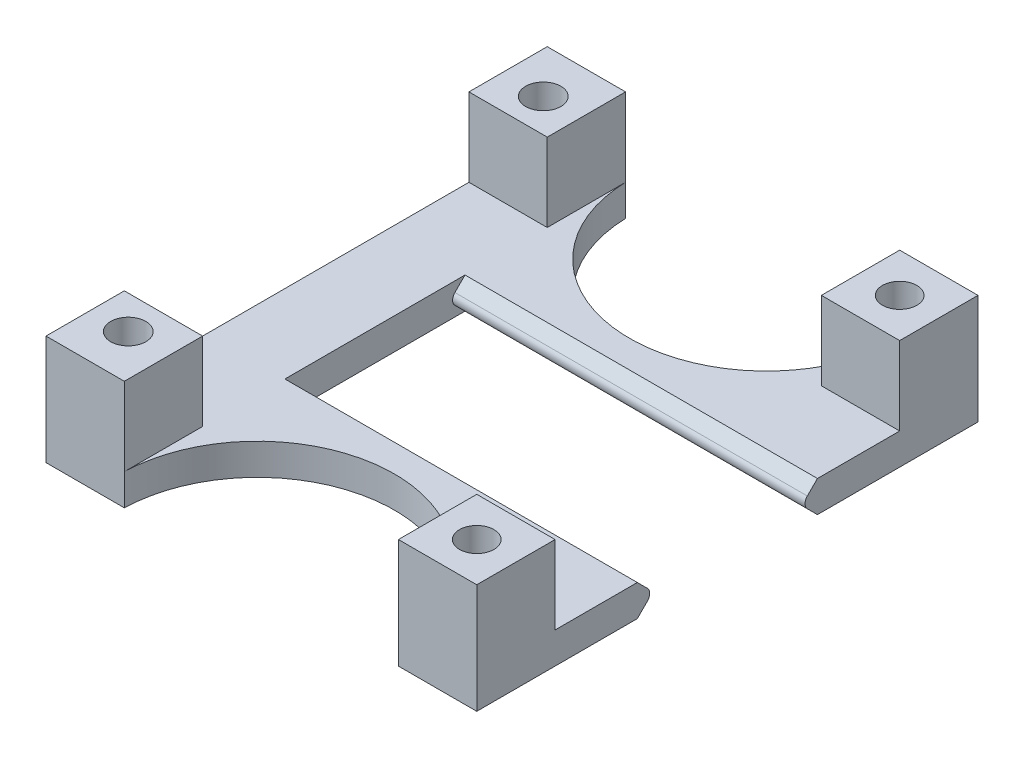
ISO-10303-21;
HEADER;
FILE_DESCRIPTION(('STEP AP214'),'2;1');
FILE_NAME('part.step','',(''),(''),'','','');
FILE_SCHEMA(('AUTOMOTIVE_DESIGN { 1 0 10303 214 1 1 1 1 }'));
ENDSEC;
DATA;
#1=APPLICATION_CONTEXT('core data for automotive mechanical design processes');
#2=APPLICATION_PROTOCOL_DEFINITION('international standard','automotive_design',2000,#1);
#3=PRODUCT_CONTEXT('',#1,'mechanical');
#4=PRODUCT('Part','Part','',(#3));
#5=PRODUCT_RELATED_PRODUCT_CATEGORY('part','',(#4));
#6=PRODUCT_DEFINITION_FORMATION('','',#4);
#7=PRODUCT_DEFINITION_CONTEXT('part definition',#1,'design');
#8=PRODUCT_DEFINITION('design','',#6,#7);
#9=PRODUCT_DEFINITION_SHAPE('','',#8);
#10=(LENGTH_UNIT() NAMED_UNIT(*) SI_UNIT(.MILLI.,.METRE.));
#11=(NAMED_UNIT(*) PLANE_ANGLE_UNIT() SI_UNIT($,.RADIAN.));
#12=(NAMED_UNIT(*) SI_UNIT($,.STERADIAN.) SOLID_ANGLE_UNIT());
#13=UNCERTAINTY_MEASURE_WITH_UNIT(LENGTH_MEASURE(1.E-05),#10,'distance_accuracy_value','');
#14=(GEOMETRIC_REPRESENTATION_CONTEXT(3) GLOBAL_UNCERTAINTY_ASSIGNED_CONTEXT((#13)) GLOBAL_UNIT_ASSIGNED_CONTEXT((#10,
#11,#12)) REPRESENTATION_CONTEXT('',''));
#15=CARTESIAN_POINT('',(0.,0.,0.));
#16=DIRECTION('',(0.,0.,1.));
#17=DIRECTION('',(1.,0.,0.));
#18=AXIS2_PLACEMENT_3D('',#15,#16,#17);
#19=CARTESIAN_POINT('',(0.,4.,0.));
#20=DIRECTION('',(0.,1.,0.));
#21=DIRECTION('',(0.,0.,1.));
#22=AXIS2_PLACEMENT_3D('',#19,#20,#21);
#23=PLANE('',#22);
#24=DIRECTION('',(1.,0.,0.));
#25=VECTOR('',#24,1.);
#26=CARTESIAN_POINT('',(5.52786404500041,4.,11.5));
#27=LINE('',#26,#25);
#28=CARTESIAN_POINT('',(10.,4.,11.5));
#29=VERTEX_POINT('',#28);
#30=CARTESIAN_POINT('',(55.,4.,11.5));
#31=VERTEX_POINT('',#30);
#32=EDGE_CURVE('E221',#29,#31,#27,.T.);
#33=ORIENTED_EDGE('',*,*,#32,.F.);
#34=DIRECTION('',(0.,0.,1.));
#35=VECTOR('',#34,1.);
#36=CARTESIAN_POINT('',(10.,4.,0.));
#37=LINE('',#36,#35);
#38=CARTESIAN_POINT('',(10.,4.,-11.5));
#39=VERTEX_POINT('',#38);
#40=EDGE_CURVE('E246',#39,#29,#37,.T.);
#41=ORIENTED_EDGE('',*,*,#40,.F.);
#42=DIRECTION('',(1.,0.,0.));
#43=VECTOR('',#42,1.);
#44=CARTESIAN_POINT('',(5.52786404500041,4.,-11.5));
#45=LINE('',#44,#43);
#46=CARTESIAN_POINT('',(55.,4.,-11.5));
#47=VERTEX_POINT('',#46);
#48=EDGE_CURVE('E452',#39,#47,#45,.T.);
#49=ORIENTED_EDGE('',*,*,#48,.T.);
#50=DIRECTION('',(0.,0.,-1.));
#51=VECTOR('',#50,1.);
#52=CARTESIAN_POINT('',(55.,4.,0.));
#53=LINE('',#52,#51);
#54=CARTESIAN_POINT('',(55.,4.,-22.));
#55=VERTEX_POINT('',#54);
#56=EDGE_CURVE('E67',#47,#55,#53,.T.);
#57=ORIENTED_EDGE('',*,*,#56,.T.);
#58=DIRECTION('',(1.,0.,0.));
#59=VECTOR('',#58,1.);
#60=CARTESIAN_POINT('',(45.,4.,-22.));
#61=LINE('',#60,#59);
#62=CARTESIAN_POINT('',(45.,4.,-22.));
#63=VERTEX_POINT('',#62);
#64=EDGE_CURVE('E62',#63,#55,#61,.T.);
#65=ORIENTED_EDGE('',*,*,#64,.F.);
#66=DIRECTION('',(0.,0.,1.));
#67=VECTOR('',#66,1.);
#68=CARTESIAN_POINT('',(45.,4.,-32.));
#69=LINE('',#68,#67);
#70=CARTESIAN_POINT('',(45.,4.,-32.));
#71=VERTEX_POINT('',#70);
#72=EDGE_CURVE('E430',#71,#63,#69,.T.);
#73=ORIENTED_EDGE('',*,*,#72,.F.);
#74=CARTESIAN_POINT('',(27.5,4.,-32.5073529411765));
#75=DIRECTION('',(0.,1.,0.));
#76=DIRECTION('',(0.,0.,1.));
#77=AXIS2_PLACEMENT_3D('',#74,#75,#76);
#78=CIRCLE('',#77,17.5073529411765);
#79=CARTESIAN_POINT('',(10.,4.,-32.));
#80=VERTEX_POINT('',#79);
#81=EDGE_CURVE('E296',#71,#80,#78,.F.);
#82=ORIENTED_EDGE('',*,*,#81,.T.);
#83=DIRECTION('',(0.,0.,-1.));
#84=VECTOR('',#83,1.);
#85=CARTESIAN_POINT('',(10.,4.,-22.));
#86=LINE('',#85,#84);
#87=CARTESIAN_POINT('',(10.,4.,-22.));
#88=VERTEX_POINT('',#87);
#89=EDGE_CURVE('E351',#88,#80,#86,.T.);
#90=ORIENTED_EDGE('',*,*,#89,.F.);
#91=DIRECTION('',(1.,0.,0.));
#92=VECTOR('',#91,1.);
#93=CARTESIAN_POINT('',(0.,4.,-22.));
#94=LINE('',#93,#92);
#95=CARTESIAN_POINT('',(0.,4.,-22.));
#96=VERTEX_POINT('',#95);
#97=EDGE_CURVE('E348',#96,#88,#94,.T.);
#98=ORIENTED_EDGE('',*,*,#97,.F.);
#99=DIRECTION('',(0.,0.,-1.));
#100=VECTOR('',#99,1.);
#101=CARTESIAN_POINT('',(0.,4.,0.));
#102=LINE('',#101,#100);
#103=CARTESIAN_POINT('',(0.,4.,22.));
#104=VERTEX_POINT('',#103);
#105=EDGE_CURVE('E251',#104,#96,#102,.T.);
#106=ORIENTED_EDGE('',*,*,#105,.F.);
#107=DIRECTION('',(-1.,0.,0.));
#108=VECTOR('',#107,1.);
#109=CARTESIAN_POINT('',(10.,4.,22.));
#110=LINE('',#109,#108);
#111=CARTESIAN_POINT('',(10.,4.,22.));
#112=VERTEX_POINT('',#111);
#113=EDGE_CURVE('E405',#112,#104,#110,.T.);
#114=ORIENTED_EDGE('',*,*,#113,.F.);
#115=DIRECTION('',(0.,0.,-1.));
#116=VECTOR('',#115,1.);
#117=CARTESIAN_POINT('',(9.99999999999999,4.,32.));
#118=LINE('',#117,#116);
#119=CARTESIAN_POINT('',(9.99999999999999,4.,32.));
#120=VERTEX_POINT('',#119);
#121=EDGE_CURVE('E408',#120,#112,#118,.T.);
#122=ORIENTED_EDGE('',*,*,#121,.F.);
#123=CARTESIAN_POINT('',(27.5,4.,32.5073529411765));
#124=DIRECTION('',(0.,1.,0.));
#125=DIRECTION('',(0.,0.,1.));
#126=AXIS2_PLACEMENT_3D('',#123,#124,#125);
#127=CIRCLE('',#126,17.5073529411765);
#128=CARTESIAN_POINT('',(45.,4.,32.));
#129=VERTEX_POINT('',#128);
#130=EDGE_CURVE('E247',#129,#120,#127,.T.);
#131=ORIENTED_EDGE('',*,*,#130,.F.);
#132=DIRECTION('',(0.,0.,1.));
#133=VECTOR('',#132,1.);
#134=CARTESIAN_POINT('',(45.,4.,32.));
#135=LINE('',#134,#133);
#136=CARTESIAN_POINT('',(45.,4.,22.));
#137=VERTEX_POINT('',#136);
#138=EDGE_CURVE('E362',#137,#129,#135,.T.);
#139=ORIENTED_EDGE('',*,*,#138,.F.);
#140=DIRECTION('',(-1.,0.,0.));
#141=VECTOR('',#140,1.);
#142=CARTESIAN_POINT('',(45.,4.,22.));
#143=LINE('',#142,#141);
#144=CARTESIAN_POINT('',(55.,4.,22.));
#145=VERTEX_POINT('',#144);
#146=EDGE_CURVE('E244',#145,#137,#143,.T.);
#147=ORIENTED_EDGE('',*,*,#146,.F.);
#148=DIRECTION('',(0.,0.,1.));
#149=VECTOR('',#148,1.);
#150=CARTESIAN_POINT('',(55.,4.,0.));
#151=LINE('',#150,#149);
#152=EDGE_CURVE('E237',#31,#145,#151,.T.);
#153=ORIENTED_EDGE('',*,*,#152,.F.);
#154=EDGE_LOOP('',(#33,#41,#49,#57,#65,#73,#82,#90,#98,#106,#114,#122,#131,#139,#147,#153));
#155=FACE_BOUND('',#154,.T.);
#156=ADVANCED_FACE('F47',(#155),#23,.T.);
#157=CARTESIAN_POINT('',(0.,4.,-32.));
#158=DIRECTION('',(0.,0.,1.));
#159=DIRECTION('',(1.,0.,0.));
#160=AXIS2_PLACEMENT_3D('',#157,#158,#159);
#161=PLANE('',#160);
#162=DIRECTION('',(-1.,0.,0.));
#163=VECTOR('',#162,1.);
#164=CARTESIAN_POINT('',(0.,0.,-32.));
#165=LINE('',#164,#163);
#166=CARTESIAN_POINT('',(55.,0.,-32.));
#167=VERTEX_POINT('',#166);
#168=CARTESIAN_POINT('',(45.,0.,-32.));
#169=VERTEX_POINT('',#168);
#170=EDGE_CURVE('E270',#167,#169,#165,.T.);
#171=ORIENTED_EDGE('',*,*,#170,.T.);
#172=DIRECTION('',(0.,-1.,0.));
#173=VECTOR('',#172,1.);
#174=CARTESIAN_POINT('',(45.,4.,-32.));
#175=LINE('',#174,#173);
#176=EDGE_CURVE('E12',#71,#169,#175,.T.);
#177=ORIENTED_EDGE('',*,*,#176,.F.);
#178=DIRECTION('',(0.,-1.,0.));
#179=VECTOR('',#178,1.);
#180=CARTESIAN_POINT('',(45.,14.,-32.));
#181=LINE('',#180,#179);
#182=CARTESIAN_POINT('',(45.,14.,-32.));
#183=VERTEX_POINT('',#182);
#184=EDGE_CURVE('E423',#183,#71,#181,.T.);
#185=ORIENTED_EDGE('',*,*,#184,.F.);
#186=DIRECTION('',(-1.,0.,0.));
#187=VECTOR('',#186,1.);
#188=CARTESIAN_POINT('',(55.,14.,-32.));
#189=LINE('',#188,#187);
#190=CARTESIAN_POINT('',(55.,14.,-32.));
#191=VERTEX_POINT('',#190);
#192=EDGE_CURVE('E436',#191,#183,#189,.T.);
#193=ORIENTED_EDGE('',*,*,#192,.F.);
#194=DIRECTION('',(0.,-1.,0.));
#195=VECTOR('',#194,1.);
#196=CARTESIAN_POINT('',(55.,4.,-32.));
#197=LINE('',#196,#195);
#198=EDGE_CURVE('E256',#191,#167,#197,.T.);
#199=ORIENTED_EDGE('',*,*,#198,.T.);
#200=EDGE_LOOP('',(#171,#177,#185,#193,#199));
#201=FACE_BOUND('',#200,.T.);
#202=ADVANCED_FACE('F506',(#201),#161,.F.);
#203=CARTESIAN_POINT('',(27.5,4.,-32.5073529411765));
#204=DIRECTION('',(0.,-1.,0.));
#205=DIRECTION('',(0.,0.,-1.));
#206=AXIS2_PLACEMENT_3D('',#203,#204,#205);
#207=CYLINDRICAL_SURFACE('',#206,17.5073529411765);
#208=CARTESIAN_POINT('',(27.5,0.,-32.5073529411765));
#209=DIRECTION('',(0.,1.,0.));
#210=DIRECTION('',(0.,0.,1.));
#211=AXIS2_PLACEMENT_3D('',#208,#209,#210);
#212=CIRCLE('',#211,17.5073529411765);
#213=CARTESIAN_POINT('',(10.,0.,-32.));
#214=VERTEX_POINT('',#213);
#215=EDGE_CURVE('E273',#169,#214,#212,.F.);
#216=ORIENTED_EDGE('',*,*,#215,.T.);
#217=DIRECTION('',(0.,-1.,0.));
#218=VECTOR('',#217,1.);
#219=CARTESIAN_POINT('',(10.,4.,-32.));
#220=LINE('',#219,#218);
#221=EDGE_CURVE('E55',#80,#214,#220,.T.);
#222=ORIENTED_EDGE('',*,*,#221,.F.);
#223=ORIENTED_EDGE('',*,*,#81,.F.);
#224=ORIENTED_EDGE('',*,*,#176,.T.);
#225=EDGE_LOOP('',(#216,#222,#223,#224));
#226=FACE_BOUND('',#225,.T.);
#227=ADVANCED_FACE('F504',(#226),#207,.F.);
#228=CARTESIAN_POINT('',(0.,4.,-32.));
#229=DIRECTION('',(0.,0.,1.));
#230=DIRECTION('',(1.,0.,0.));
#231=AXIS2_PLACEMENT_3D('',#228,#229,#230);
#232=PLANE('',#231);
#233=DIRECTION('',(-1.,0.,0.));
#234=VECTOR('',#233,1.);
#235=CARTESIAN_POINT('',(0.,0.,-32.));
#236=LINE('',#235,#234);
#237=CARTESIAN_POINT('',(0.,0.,-32.));
#238=VERTEX_POINT('',#237);
#239=EDGE_CURVE('E275',#214,#238,#236,.T.);
#240=ORIENTED_EDGE('',*,*,#239,.T.);
#241=DIRECTION('',(0.,-1.,0.));
#242=VECTOR('',#241,1.);
#243=CARTESIAN_POINT('',(0.,4.,-32.));
#244=LINE('',#243,#242);
#245=CARTESIAN_POINT('',(0.,14.,-32.));
#246=VERTEX_POINT('',#245);
#247=EDGE_CURVE('E308',#246,#238,#244,.T.);
#248=ORIENTED_EDGE('',*,*,#247,.F.);
#249=DIRECTION('',(-1.,0.,0.));
#250=VECTOR('',#249,1.);
#251=CARTESIAN_POINT('',(10.,14.,-32.));
#252=LINE('',#251,#250);
#253=CARTESIAN_POINT('',(10.,14.,-32.));
#254=VERTEX_POINT('',#253);
#255=EDGE_CURVE('E335',#254,#246,#252,.T.);
#256=ORIENTED_EDGE('',*,*,#255,.F.);
#257=DIRECTION('',(0.,-1.,0.));
#258=VECTOR('',#257,1.);
#259=CARTESIAN_POINT('',(10.,14.,-32.));
#260=LINE('',#259,#258);
#261=EDGE_CURVE('E317',#254,#80,#260,.T.);
#262=ORIENTED_EDGE('',*,*,#261,.T.);
#263=ORIENTED_EDGE('',*,*,#221,.T.);
#264=EDGE_LOOP('',(#240,#248,#256,#262,#263));
#265=FACE_BOUND('',#264,.T.);
#266=ADVANCED_FACE('F314',(#265),#232,.F.);
#267=CARTESIAN_POINT('',(0.,4.,0.));
#268=DIRECTION('',(-1.,0.,0.));
#269=DIRECTION('',(0.,0.,1.));
#270=AXIS2_PLACEMENT_3D('',#267,#268,#269);
#271=PLANE('',#270);
#272=DIRECTION('',(0.,0.,-1.));
#273=VECTOR('',#272,1.);
#274=CARTESIAN_POINT('',(0.,0.,0.));
#275=LINE('',#274,#273);
#276=CARTESIAN_POINT('',(0.,0.,32.));
#277=VERTEX_POINT('',#276);
#278=EDGE_CURVE('E278',#277,#238,#275,.T.);
#279=ORIENTED_EDGE('',*,*,#278,.F.);
#280=DIRECTION('',(0.,-1.,0.));
#281=VECTOR('',#280,1.);
#282=CARTESIAN_POINT('',(0.,4.,32.));
#283=LINE('',#282,#281);
#284=CARTESIAN_POINT('',(0.,14.,32.));
#285=VERTEX_POINT('',#284);
#286=EDGE_CURVE('E306',#285,#277,#283,.T.);
#287=ORIENTED_EDGE('',*,*,#286,.F.);
#288=DIRECTION('',(0.,0.,1.));
#289=VECTOR('',#288,1.);
#290=CARTESIAN_POINT('',(0.,14.,22.));
#291=LINE('',#290,#289);
#292=CARTESIAN_POINT('',(0.,14.,22.));
#293=VERTEX_POINT('',#292);
#294=EDGE_CURVE('E413',#293,#285,#291,.T.);
#295=ORIENTED_EDGE('',*,*,#294,.F.);
#296=DIRECTION('',(0.,-1.,0.));
#297=VECTOR('',#296,1.);
#298=CARTESIAN_POINT('',(0.,14.,22.));
#299=LINE('',#298,#297);
#300=EDGE_CURVE('E387',#293,#104,#299,.T.);
#301=ORIENTED_EDGE('',*,*,#300,.T.);
#302=ORIENTED_EDGE('',*,*,#105,.T.);
#303=DIRECTION('',(0.,-1.,0.));
#304=VECTOR('',#303,1.);
#305=CARTESIAN_POINT('',(0.,14.,-22.));
#306=LINE('',#305,#304);
#307=CARTESIAN_POINT('',(0.,14.,-22.));
#308=VERTEX_POINT('',#307);
#309=EDGE_CURVE('E342',#308,#96,#306,.T.);
#310=ORIENTED_EDGE('',*,*,#309,.F.);
#311=DIRECTION('',(0.,0.,1.));
#312=VECTOR('',#311,1.);
#313=CARTESIAN_POINT('',(0.,14.,-32.));
#314=LINE('',#313,#312);
#315=EDGE_CURVE('E333',#246,#308,#314,.T.);
#316=ORIENTED_EDGE('',*,*,#315,.F.);
#317=ORIENTED_EDGE('',*,*,#247,.T.);
#318=EDGE_LOOP('',(#279,#287,#295,#301,#302,#310,#316,#317));
#319=FACE_BOUND('',#318,.T.);
#320=ADVANCED_FACE('F328',(#319),#271,.T.);
#321=CARTESIAN_POINT('',(0.,4.,32.));
#322=DIRECTION('',(0.,0.,1.));
#323=DIRECTION('',(1.,0.,0.));
#324=AXIS2_PLACEMENT_3D('',#321,#322,#323);
#325=PLANE('',#324);
#326=DIRECTION('',(-1.,0.,0.));
#327=VECTOR('',#326,1.);
#328=CARTESIAN_POINT('',(0.,0.,32.));
#329=LINE('',#328,#327);
#330=CARTESIAN_POINT('',(10.,0.,32.));
#331=VERTEX_POINT('',#330);
#332=EDGE_CURVE('E281',#331,#277,#329,.T.);
#333=ORIENTED_EDGE('',*,*,#332,.F.);
#334=DIRECTION('',(0.,-1.,0.));
#335=VECTOR('',#334,1.);
#336=CARTESIAN_POINT('',(10.,4.,32.));
#337=LINE('',#336,#335);
#338=EDGE_CURVE('E304',#120,#331,#337,.T.);
#339=ORIENTED_EDGE('',*,*,#338,.F.);
#340=DIRECTION('',(0.,-1.,0.));
#341=VECTOR('',#340,1.);
#342=CARTESIAN_POINT('',(9.99999999999999,14.,32.));
#343=LINE('',#342,#341);
#344=CARTESIAN_POINT('',(9.99999999999999,14.,32.));
#345=VERTEX_POINT('',#344);
#346=EDGE_CURVE('E402',#345,#120,#343,.T.);
#347=ORIENTED_EDGE('',*,*,#346,.F.);
#348=DIRECTION('',(1.,0.,0.));
#349=VECTOR('',#348,1.);
#350=CARTESIAN_POINT('',(0.,14.,32.));
#351=LINE('',#350,#349);
#352=EDGE_CURVE('E404',#285,#345,#351,.T.);
#353=ORIENTED_EDGE('',*,*,#352,.F.);
#354=ORIENTED_EDGE('',*,*,#286,.T.);
#355=EDGE_LOOP('',(#333,#339,#347,#353,#354));
#356=FACE_BOUND('',#355,.T.);
#357=ADVANCED_FACE('F530',(#356),#325,.T.);
#358=CARTESIAN_POINT('',(27.5,4.,32.5073529411765));
#359=DIRECTION('',(0.,-1.,0.));
#360=DIRECTION('',(0.,0.,-1.));
#361=AXIS2_PLACEMENT_3D('',#358,#359,#360);
#362=CYLINDRICAL_SURFACE('',#361,17.5073529411765);
#363=CARTESIAN_POINT('',(27.5,0.,32.5073529411765));
#364=DIRECTION('',(0.,1.,0.));
#365=DIRECTION('',(0.,0.,1.));
#366=AXIS2_PLACEMENT_3D('',#363,#364,#365);
#367=CIRCLE('',#366,17.5073529411765);
#368=CARTESIAN_POINT('',(45.,0.,32.));
#369=VERTEX_POINT('',#368);
#370=EDGE_CURVE('E284',#369,#331,#367,.T.);
#371=ORIENTED_EDGE('',*,*,#370,.F.);
#372=DIRECTION('',(0.,-1.,0.));
#373=VECTOR('',#372,1.);
#374=CARTESIAN_POINT('',(45.,4.,32.));
#375=LINE('',#374,#373);
#376=EDGE_CURVE('E302',#129,#369,#375,.T.);
#377=ORIENTED_EDGE('',*,*,#376,.F.);
#378=ORIENTED_EDGE('',*,*,#130,.T.);
#379=ORIENTED_EDGE('',*,*,#338,.T.);
#380=EDGE_LOOP('',(#371,#377,#378,#379));
#381=FACE_BOUND('',#380,.T.);
#382=ADVANCED_FACE('F525',(#381),#362,.F.);
#383=CARTESIAN_POINT('',(0.,4.,32.));
#384=DIRECTION('',(0.,0.,1.));
#385=DIRECTION('',(1.,0.,0.));
#386=AXIS2_PLACEMENT_3D('',#383,#384,#385);
#387=PLANE('',#386);
#388=DIRECTION('',(-1.,0.,0.));
#389=VECTOR('',#388,1.);
#390=CARTESIAN_POINT('',(0.,0.,32.));
#391=LINE('',#390,#389);
#392=CARTESIAN_POINT('',(55.,0.,32.));
#393=VERTEX_POINT('',#392);
#394=EDGE_CURVE('E287',#393,#369,#391,.T.);
#395=ORIENTED_EDGE('',*,*,#394,.F.);
#396=DIRECTION('',(0.,-1.,0.));
#397=VECTOR('',#396,1.);
#398=CARTESIAN_POINT('',(55.,4.,32.));
#399=LINE('',#398,#397);
#400=CARTESIAN_POINT('',(55.,14.,32.));
#401=VERTEX_POINT('',#400);
#402=EDGE_CURVE('E299',#401,#393,#399,.T.);
#403=ORIENTED_EDGE('',*,*,#402,.F.);
#404=DIRECTION('',(1.,0.,0.));
#405=VECTOR('',#404,1.);
#406=CARTESIAN_POINT('',(55.,14.,32.));
#407=LINE('',#406,#405);
#408=CARTESIAN_POINT('',(45.,14.,32.));
#409=VERTEX_POINT('',#408);
#410=EDGE_CURVE('E366',#409,#401,#407,.T.);
#411=ORIENTED_EDGE('',*,*,#410,.F.);
#412=DIRECTION('',(0.,-1.,0.));
#413=VECTOR('',#412,1.);
#414=CARTESIAN_POINT('',(45.,14.,32.));
#415=LINE('',#414,#413);
#416=EDGE_CURVE('E261',#409,#129,#415,.T.);
#417=ORIENTED_EDGE('',*,*,#416,.T.);
#418=ORIENTED_EDGE('',*,*,#376,.T.);
#419=EDGE_LOOP('',(#395,#403,#411,#417,#418));
#420=FACE_BOUND('',#419,.T.);
#421=ADVANCED_FACE('F522',(#420),#387,.T.);
#422=CARTESIAN_POINT('',(55.,4.,0.));
#423=DIRECTION('',(1.,0.,0.));
#424=DIRECTION('',(0.,0.,-1.));
#425=AXIS2_PLACEMENT_3D('',#422,#423,#424);
#426=PLANE('',#425);
#427=DIRECTION('',(0.,-0.707106781186551,0.707106781186544));
#428=VECTOR('',#427,1.);
#429=CARTESIAN_POINT('',(55.,1.29289321881344,10.2071067811866));
#430=LINE('',#429,#428);
#431=CARTESIAN_POINT('',(55.,1.29289321881344,10.2071067811866));
#432=VERTEX_POINT('',#431);
#433=CARTESIAN_POINT('',(55.,0.,11.5));
#434=VERTEX_POINT('',#433);
#435=EDGE_CURVE('E231',#432,#434,#430,.T.);
#436=ORIENTED_EDGE('',*,*,#435,.F.);
#437=CARTESIAN_POINT('',(55.,1.99999999999999,10.9142135623731));
#438=DIRECTION('',(-1.,0.,0.));
#439=DIRECTION('',(0.,0.,1.));
#440=AXIS2_PLACEMENT_3D('',#437,#438,#439);
#441=CIRCLE('',#440,1.);
#442=CARTESIAN_POINT('',(55.,2.70710678118655,10.2071067811866));
#443=VERTEX_POINT('',#442);
#444=EDGE_CURVE('E240',#443,#432,#441,.T.);
#445=ORIENTED_EDGE('',*,*,#444,.F.);
#446=DIRECTION('',(0.,-0.707106781186546,-0.707106781186549));
#447=VECTOR('',#446,1.);
#448=CARTESIAN_POINT('',(55.,2.70710678118655,10.2071067811866));
#449=LINE('',#448,#447);
#450=EDGE_CURVE('E225',#31,#443,#449,.T.);
#451=ORIENTED_EDGE('',*,*,#450,.F.);
#452=ORIENTED_EDGE('',*,*,#152,.T.);
#453=DIRECTION('',(0.,-1.,0.));
#454=VECTOR('',#453,1.);
#455=CARTESIAN_POINT('',(55.,14.,22.));
#456=LINE('',#455,#454);
#457=CARTESIAN_POINT('',(55.,14.,22.));
#458=VERTEX_POINT('',#457);
#459=EDGE_CURVE('E379',#458,#145,#456,.T.);
#460=ORIENTED_EDGE('',*,*,#459,.F.);
#461=DIRECTION('',(0.,0.,-1.));
#462=VECTOR('',#461,1.);
#463=CARTESIAN_POINT('',(55.,14.,22.));
#464=LINE('',#463,#462);
#465=EDGE_CURVE('E369',#401,#458,#464,.T.);
#466=ORIENTED_EDGE('',*,*,#465,.F.);
#467=ORIENTED_EDGE('',*,*,#402,.T.);
#468=DIRECTION('',(0.,0.,1.));
#469=VECTOR('',#468,1.);
#470=CARTESIAN_POINT('',(55.,0.,0.));
#471=LINE('',#470,#469);
#472=EDGE_CURVE('E290',#434,#393,#471,.T.);
#473=ORIENTED_EDGE('',*,*,#472,.F.);
#474=EDGE_LOOP('',(#436,#445,#451,#452,#460,#466,#467,#473));
#475=FACE_BOUND('',#474,.T.);
#476=ADVANCED_FACE('F235',(#475),#426,.T.);
#477=CARTESIAN_POINT('',(10.,4.,0.));
#478=DIRECTION('',(1.,0.,0.));
#479=DIRECTION('',(0.,0.,-1.));
#480=AXIS2_PLACEMENT_3D('',#477,#478,#479);
#481=PLANE('',#480);
#482=DIRECTION('',(0.,0.,1.));
#483=VECTOR('',#482,1.);
#484=CARTESIAN_POINT('',(10.,0.,0.));
#485=LINE('',#484,#483);
#486=CARTESIAN_POINT('',(10.,0.,-11.5));
#487=VERTEX_POINT('',#486);
#488=CARTESIAN_POINT('',(10.,0.,11.5));
#489=VERTEX_POINT('',#488);
#490=EDGE_CURVE('E292',#487,#489,#485,.T.);
#491=ORIENTED_EDGE('',*,*,#490,.F.);
#492=DIRECTION('',(0.,-0.707106781186539,-0.707106781186556));
#493=VECTOR('',#492,1.);
#494=CARTESIAN_POINT('',(10.,1.29289321881345,-10.2071067811865));
#495=LINE('',#494,#493);
#496=CARTESIAN_POINT('',(10.,1.29289321881344,-10.2071067811865));
#497=VERTEX_POINT('',#496);
#498=EDGE_CURVE('E454',#497,#487,#495,.T.);
#499=ORIENTED_EDGE('',*,*,#498,.F.);
#500=CARTESIAN_POINT('',(10.,2.,-10.9142135623731));
#501=DIRECTION('',(1.,0.,0.));
#502=DIRECTION('',(0.,0.,-1.));
#503=AXIS2_PLACEMENT_3D('',#500,#501,#502);
#504=CIRCLE('',#503,1.);
#505=CARTESIAN_POINT('',(10.,2.70710678118655,-10.2071067811865));
#506=VERTEX_POINT('',#505);
#507=EDGE_CURVE('E463',#506,#497,#504,.T.);
#508=ORIENTED_EDGE('',*,*,#507,.F.);
#509=DIRECTION('',(0.,-0.707106781186543,0.707106781186552));
#510=VECTOR('',#509,1.);
#511=CARTESIAN_POINT('',(10.,2.70710678118654,-10.2071067811865));
#512=LINE('',#511,#510);
#513=EDGE_CURVE('E241',#39,#506,#512,.T.);
#514=ORIENTED_EDGE('',*,*,#513,.F.);
#515=ORIENTED_EDGE('',*,*,#40,.T.);
#516=DIRECTION('',(0.,0.707106781186546,0.707106781186549));
#517=VECTOR('',#516,1.);
#518=CARTESIAN_POINT('',(10.,2.70710678118655,10.2071067811866));
#519=LINE('',#518,#517);
#520=CARTESIAN_POINT('',(10.,2.70710678118655,10.2071067811866));
#521=VERTEX_POINT('',#520);
#522=EDGE_CURVE('E228',#521,#29,#519,.T.);
#523=ORIENTED_EDGE('',*,*,#522,.F.);
#524=CARTESIAN_POINT('',(10.,1.99999999999999,10.9142135623731));
#525=DIRECTION('',(1.,0.,0.));
#526=DIRECTION('',(0.,0.,-1.));
#527=AXIS2_PLACEMENT_3D('',#524,#525,#526);
#528=CIRCLE('',#527,1.);
#529=CARTESIAN_POINT('',(10.,1.29289321881344,10.2071067811866));
#530=VERTEX_POINT('',#529);
#531=EDGE_CURVE('E475',#530,#521,#528,.T.);
#532=ORIENTED_EDGE('',*,*,#531,.F.);
#533=DIRECTION('',(0.,0.707106781186551,-0.707106781186544));
#534=VECTOR('',#533,1.);
#535=CARTESIAN_POINT('',(10.,1.29289321881344,10.2071067811866));
#536=LINE('',#535,#534);
#537=EDGE_CURVE('E467',#489,#530,#536,.T.);
#538=ORIENTED_EDGE('',*,*,#537,.F.);
#539=EDGE_LOOP('',(#491,#499,#508,#514,#515,#523,#532,#538));
#540=FACE_BOUND('',#539,.T.);
#541=ADVANCED_FACE('F485',(#540),#481,.T.);
#542=CARTESIAN_POINT('',(50.,4.,-27.));
#543=DIRECTION('',(0.,-1.,0.));
#544=DIRECTION('',(0.,0.,-1.));
#545=AXIS2_PLACEMENT_3D('',#542,#543,#544);
#546=CYLINDRICAL_SURFACE('',#545,2.2);
#547=CARTESIAN_POINT('',(50.,0.,-27.));
#548=DIRECTION('',(0.,1.,0.));
#549=DIRECTION('',(0.,0.,1.));
#550=AXIS2_PLACEMENT_3D('',#547,#548,#549);
#551=CIRCLE('',#550,2.2);
#552=CARTESIAN_POINT('',(50.,0.,-24.8));
#553=VERTEX_POINT('',#552);
#554=EDGE_CURVE('E267',#553,#553,#551,.T.);
#555=ORIENTED_EDGE('',*,*,#554,.F.);
#556=EDGE_LOOP('',(#555));
#557=FACE_BOUND('',#556,.T.);
#558=CARTESIAN_POINT('',(50.,14.,-27.));
#559=DIRECTION('',(0.,1.,0.));
#560=DIRECTION('',(0.,0.,1.));
#561=AXIS2_PLACEMENT_3D('',#558,#559,#560);
#562=CIRCLE('',#561,2.20000000000001);
#563=CARTESIAN_POINT('',(50.,14.,-24.8));
#564=VERTEX_POINT('',#563);
#565=EDGE_CURVE('E434',#564,#564,#562,.T.);
#566=ORIENTED_EDGE('',*,*,#565,.T.);
#567=EDGE_LOOP('',(#566));
#568=FACE_BOUND('',#567,.T.);
#569=ADVANCED_FACE('F569',(#557,#568),#546,.F.);
#570=CARTESIAN_POINT('',(50.,4.,27.));
#571=DIRECTION('',(0.,-1.,0.));
#572=DIRECTION('',(0.,0.,-1.));
#573=AXIS2_PLACEMENT_3D('',#570,#571,#572);
#574=CYLINDRICAL_SURFACE('',#573,2.2);
#575=CARTESIAN_POINT('',(50.,0.,27.));
#576=DIRECTION('',(0.,1.,0.));
#577=DIRECTION('',(0.,0.,1.));
#578=AXIS2_PLACEMENT_3D('',#575,#576,#577);
#579=CIRCLE('',#578,2.2);
#580=CARTESIAN_POINT('',(50.,0.,29.2));
#581=VERTEX_POINT('',#580);
#582=EDGE_CURVE('E264',#581,#581,#579,.T.);
#583=ORIENTED_EDGE('',*,*,#582,.F.);
#584=EDGE_LOOP('',(#583));
#585=FACE_BOUND('',#584,.T.);
#586=CARTESIAN_POINT('',(50.,14.,27.));
#587=DIRECTION('',(0.,1.,0.));
#588=DIRECTION('',(0.,0.,1.));
#589=AXIS2_PLACEMENT_3D('',#586,#587,#588);
#590=CIRCLE('',#589,2.2);
#591=CARTESIAN_POINT('',(50.,14.,29.2));
#592=VERTEX_POINT('',#591);
#593=EDGE_CURVE('E359',#592,#592,#590,.T.);
#594=ORIENTED_EDGE('',*,*,#593,.T.);
#595=EDGE_LOOP('',(#594));
#596=FACE_BOUND('',#595,.T.);
#597=ADVANCED_FACE('F586',(#585,#596),#574,.F.);
#598=CARTESIAN_POINT('',(4.75533362153762,4.,26.2505701139208));
#599=DIRECTION('',(0.,-1.,0.));
#600=DIRECTION('',(0.,0.,-1.));
#601=AXIS2_PLACEMENT_3D('',#598,#599,#600);
#602=CYLINDRICAL_SURFACE('',#601,2.24789999999999);
#603=CARTESIAN_POINT('',(4.75533362153762,0.,26.2505701139208));
#604=DIRECTION('',(0.,1.,0.));
#605=DIRECTION('',(0.,0.,1.));
#606=AXIS2_PLACEMENT_3D('',#603,#604,#605);
#607=CIRCLE('',#606,2.24789999999999);
#608=CARTESIAN_POINT('',(4.75533362153762,0.,28.4984701139208));
#609=VERTEX_POINT('',#608);
#610=EDGE_CURVE('E260',#609,#609,#607,.T.);
#611=ORIENTED_EDGE('',*,*,#610,.F.);
#612=EDGE_LOOP('',(#611));
#613=FACE_BOUND('',#612,.T.);
#614=CARTESIAN_POINT('',(4.75533362153762,14.,26.2505701139208));
#615=DIRECTION('',(0.,1.,0.));
#616=DIRECTION('',(0.,0.,1.));
#617=AXIS2_PLACEMENT_3D('',#614,#615,#616);
#618=CIRCLE('',#617,2.24789999999999);
#619=CARTESIAN_POINT('',(4.75533362153762,14.,28.4984701139208));
#620=VERTEX_POINT('',#619);
#621=EDGE_CURVE('E411',#620,#620,#618,.T.);
#622=ORIENTED_EDGE('',*,*,#621,.T.);
#623=EDGE_LOOP('',(#622));
#624=FACE_BOUND('',#623,.T.);
#625=ADVANCED_FACE('F589',(#613,#624),#602,.F.);
#626=CARTESIAN_POINT('',(5.244634232786,4.,-26.2471496928654));
#627=DIRECTION('',(0.,-1.,0.));
#628=DIRECTION('',(0.,0.,-1.));
#629=AXIS2_PLACEMENT_3D('',#626,#627,#628);
#630=CYLINDRICAL_SURFACE('',#629,2.24789999999999);
#631=CARTESIAN_POINT('',(5.244634232786,0.,-26.2471496928654));
#632=DIRECTION('',(0.,1.,0.));
#633=DIRECTION('',(0.,0.,1.));
#634=AXIS2_PLACEMENT_3D('',#631,#632,#633);
#635=CIRCLE('',#634,2.24789999999999);
#636=CARTESIAN_POINT('',(5.244634232786,0.,-23.9992496928654));
#637=VERTEX_POINT('',#636);
#638=EDGE_CURVE('E257',#637,#637,#635,.T.);
#639=ORIENTED_EDGE('',*,*,#638,.F.);
#640=EDGE_LOOP('',(#639));
#641=FACE_BOUND('',#640,.T.);
#642=CARTESIAN_POINT('',(5.244634232786,14.,-26.2471496928654));
#643=DIRECTION('',(0.,1.,0.));
#644=DIRECTION('',(0.,0.,1.));
#645=AXIS2_PLACEMENT_3D('',#642,#643,#644);
#646=CIRCLE('',#645,2.24789999999999);
#647=CARTESIAN_POINT('',(5.244634232786,14.,-23.9992496928654));
#648=VERTEX_POINT('',#647);
#649=EDGE_CURVE('E352',#648,#648,#646,.T.);
#650=ORIENTED_EDGE('',*,*,#649,.T.);
#651=EDGE_LOOP('',(#650));
#652=FACE_BOUND('',#651,.T.);
#653=ADVANCED_FACE('F49',(#641,#652),#630,.F.);
#654=CARTESIAN_POINT('',(55.,4.,0.));
#655=DIRECTION('',(-1.,0.,0.));
#656=DIRECTION('',(0.,0.,1.));
#657=AXIS2_PLACEMENT_3D('',#654,#655,#656);
#658=PLANE('',#657);
#659=ORIENTED_EDGE('',*,*,#56,.F.);
#660=DIRECTION('',(0.,0.707106781186543,-0.707106781186552));
#661=VECTOR('',#660,1.);
#662=CARTESIAN_POINT('',(55.,2.70710678118654,-10.2071067811865));
#663=LINE('',#662,#661);
#664=CARTESIAN_POINT('',(55.,2.70710678118654,-10.2071067811865));
#665=VERTEX_POINT('',#664);
#666=EDGE_CURVE('E448',#665,#47,#663,.T.);
#667=ORIENTED_EDGE('',*,*,#666,.F.);
#668=CARTESIAN_POINT('',(55.,2.,-10.9142135623731));
#669=DIRECTION('',(-1.,0.,0.));
#670=DIRECTION('',(0.,0.,-1.));
#671=AXIS2_PLACEMENT_3D('',#668,#669,#670);
#672=CIRCLE('',#671,1.);
#673=CARTESIAN_POINT('',(55.,1.29289321881345,-10.2071067811865));
#674=VERTEX_POINT('',#673);
#675=EDGE_CURVE('E456',#674,#665,#672,.T.);
#676=ORIENTED_EDGE('',*,*,#675,.F.);
#677=DIRECTION('',(0.,0.707106781186539,0.707106781186556));
#678=VECTOR('',#677,1.);
#679=CARTESIAN_POINT('',(55.,1.29289321881345,-10.2071067811865));
#680=LINE('',#679,#678);
#681=CARTESIAN_POINT('',(55.,0.,-11.5));
#682=VERTEX_POINT('',#681);
#683=EDGE_CURVE('E459',#682,#674,#680,.T.);
#684=ORIENTED_EDGE('',*,*,#683,.F.);
#685=DIRECTION('',(0.,0.,-1.));
#686=VECTOR('',#685,1.);
#687=CARTESIAN_POINT('',(55.,0.,0.));
#688=LINE('',#687,#686);
#689=EDGE_CURVE('E294',#682,#167,#688,.T.);
#690=ORIENTED_EDGE('',*,*,#689,.T.);
#691=ORIENTED_EDGE('',*,*,#198,.F.);
#692=DIRECTION('',(0.,0.,-1.));
#693=VECTOR('',#692,1.);
#694=CARTESIAN_POINT('',(55.,14.,-22.));
#695=LINE('',#694,#693);
#696=CARTESIAN_POINT('',(55.,14.,-22.));
#697=VERTEX_POINT('',#696);
#698=EDGE_CURVE('E438',#697,#191,#695,.T.);
#699=ORIENTED_EDGE('',*,*,#698,.F.);
#700=DIRECTION('',(0.,-1.,0.));
#701=VECTOR('',#700,1.);
#702=CARTESIAN_POINT('',(55.,14.,-22.));
#703=LINE('',#702,#701);
#704=EDGE_CURVE('E421',#697,#55,#703,.T.);
#705=ORIENTED_EDGE('',*,*,#704,.T.);
#706=EDGE_LOOP('',(#659,#667,#676,#684,#690,#691,#699,#705));
#707=FACE_BOUND('',#706,.T.);
#708=ADVANCED_FACE('F492',(#707),#658,.F.);
#709=CARTESIAN_POINT('',(0.,0.,0.));
#710=DIRECTION('',(0.,1.,0.));
#711=DIRECTION('',(0.,0.,1.));
#712=AXIS2_PLACEMENT_3D('',#709,#710,#711);
#713=PLANE('',#712);
#714=ORIENTED_EDGE('',*,*,#490,.T.);
#715=DIRECTION('',(1.,0.,0.));
#716=VECTOR('',#715,1.);
#717=CARTESIAN_POINT('',(5.52786404500041,0.,11.5));
#718=LINE('',#717,#716);
#719=EDGE_CURVE('E472',#489,#434,#718,.T.);
#720=ORIENTED_EDGE('',*,*,#719,.T.);
#721=ORIENTED_EDGE('',*,*,#472,.T.);
#722=ORIENTED_EDGE('',*,*,#394,.T.);
#723=ORIENTED_EDGE('',*,*,#370,.T.);
#724=ORIENTED_EDGE('',*,*,#332,.T.);
#725=ORIENTED_EDGE('',*,*,#278,.T.);
#726=ORIENTED_EDGE('',*,*,#239,.F.);
#727=ORIENTED_EDGE('',*,*,#215,.F.);
#728=ORIENTED_EDGE('',*,*,#170,.F.);
#729=ORIENTED_EDGE('',*,*,#689,.F.);
#730=DIRECTION('',(1.,0.,0.));
#731=VECTOR('',#730,1.);
#732=CARTESIAN_POINT('',(5.52786404500041,0.,-11.5));
#733=LINE('',#732,#731);
#734=EDGE_CURVE('E445',#487,#682,#733,.T.);
#735=ORIENTED_EDGE('',*,*,#734,.F.);
#736=EDGE_LOOP('',(#714,#720,#721,#722,#723,#724,#725,#726,#727,#728,#729,#735));
#737=FACE_BOUND('',#736,.T.);
#738=ORIENTED_EDGE('',*,*,#638,.T.);
#739=EDGE_LOOP('',(#738));
#740=FACE_BOUND('',#739,.T.);
#741=ORIENTED_EDGE('',*,*,#610,.T.);
#742=EDGE_LOOP('',(#741));
#743=FACE_BOUND('',#742,.T.);
#744=ORIENTED_EDGE('',*,*,#582,.T.);
#745=EDGE_LOOP('',(#744));
#746=FACE_BOUND('',#745,.T.);
#747=ORIENTED_EDGE('',*,*,#554,.T.);
#748=EDGE_LOOP('',(#747));
#749=FACE_BOUND('',#748,.T.);
#750=ADVANCED_FACE('F322',(#737,#740,#743,#746,#749),#713,.F.);
#751=CARTESIAN_POINT('',(0.,14.,0.));
#752=DIRECTION('',(0.,-1.,0.));
#753=DIRECTION('',(0.,0.,-1.));
#754=AXIS2_PLACEMENT_3D('',#751,#752,#753);
#755=PLANE('',#754);
#756=DIRECTION('',(0.,0.,1.));
#757=VECTOR('',#756,1.);
#758=CARTESIAN_POINT('',(45.,14.,32.));
#759=LINE('',#758,#757);
#760=CARTESIAN_POINT('',(45.,14.,22.));
#761=VERTEX_POINT('',#760);
#762=EDGE_CURVE('E363',#761,#409,#759,.T.);
#763=ORIENTED_EDGE('',*,*,#762,.T.);
#764=ORIENTED_EDGE('',*,*,#410,.T.);
#765=ORIENTED_EDGE('',*,*,#465,.T.);
#766=DIRECTION('',(-1.,0.,0.));
#767=VECTOR('',#766,1.);
#768=CARTESIAN_POINT('',(45.,14.,22.));
#769=LINE('',#768,#767);
#770=EDGE_CURVE('E371',#458,#761,#769,.T.);
#771=ORIENTED_EDGE('',*,*,#770,.T.);
#772=EDGE_LOOP('',(#763,#764,#765,#771));
#773=FACE_BOUND('',#772,.T.);
#774=ORIENTED_EDGE('',*,*,#593,.F.);
#775=EDGE_LOOP('',(#774));
#776=FACE_BOUND('',#775,.T.);
#777=ADVANCED_FACE('F564',(#773,#776),#755,.F.);
#778=CARTESIAN_POINT('',(45.,14.,32.));
#779=DIRECTION('',(1.,0.,0.));
#780=DIRECTION('',(0.,0.,-1.));
#781=AXIS2_PLACEMENT_3D('',#778,#779,#780);
#782=PLANE('',#781);
#783=ORIENTED_EDGE('',*,*,#138,.T.);
#784=ORIENTED_EDGE('',*,*,#416,.F.);
#785=ORIENTED_EDGE('',*,*,#762,.F.);
#786=DIRECTION('',(0.,-1.,0.));
#787=VECTOR('',#786,1.);
#788=CARTESIAN_POINT('',(45.,14.,22.));
#789=LINE('',#788,#787);
#790=EDGE_CURVE('E373',#761,#137,#789,.T.);
#791=ORIENTED_EDGE('',*,*,#790,.T.);
#792=EDGE_LOOP('',(#783,#784,#785,#791));
#793=FACE_BOUND('',#792,.T.);
#794=ADVANCED_FACE('F560',(#793),#782,.F.);
#795=CARTESIAN_POINT('',(45.,14.,22.));
#796=DIRECTION('',(0.,0.,1.));
#797=DIRECTION('',(1.,0.,0.));
#798=AXIS2_PLACEMENT_3D('',#795,#796,#797);
#799=PLANE('',#798);
#800=ORIENTED_EDGE('',*,*,#146,.T.);
#801=ORIENTED_EDGE('',*,*,#790,.F.);
#802=ORIENTED_EDGE('',*,*,#770,.F.);
#803=ORIENTED_EDGE('',*,*,#459,.T.);
#804=EDGE_LOOP('',(#800,#801,#802,#803));
#805=FACE_BOUND('',#804,.T.);
#806=ADVANCED_FACE('F738',(#805),#799,.F.);
#807=CARTESIAN_POINT('',(0.,14.,0.));
#808=DIRECTION('',(0.,1.,0.));
#809=DIRECTION('',(0.,0.,1.));
#810=AXIS2_PLACEMENT_3D('',#807,#808,#809);
#811=PLANE('',#810);
#812=DIRECTION('',(1.,0.,0.));
#813=VECTOR('',#812,1.);
#814=CARTESIAN_POINT('',(0.,14.,-22.));
#815=LINE('',#814,#813);
#816=CARTESIAN_POINT('',(10.,14.,-22.));
#817=VERTEX_POINT('',#816);
#818=EDGE_CURVE('E344',#308,#817,#815,.T.);
#819=ORIENTED_EDGE('',*,*,#818,.T.);
#820=DIRECTION('',(0.,0.,-1.));
#821=VECTOR('',#820,1.);
#822=CARTESIAN_POINT('',(10.,14.,-22.));
#823=LINE('',#822,#821);
#824=EDGE_CURVE('E340',#817,#254,#823,.T.);
#825=ORIENTED_EDGE('',*,*,#824,.T.);
#826=ORIENTED_EDGE('',*,*,#255,.T.);
#827=ORIENTED_EDGE('',*,*,#315,.T.);
#828=EDGE_LOOP('',(#819,#825,#826,#827));
#829=FACE_BOUND('',#828,.T.);
#830=ORIENTED_EDGE('',*,*,#649,.F.);
#831=EDGE_LOOP('',(#830));
#832=FACE_BOUND('',#831,.T.);
#833=ADVANCED_FACE('F338',(#829,#832),#811,.T.);
#834=CARTESIAN_POINT('',(0.,14.,-22.));
#835=DIRECTION('',(0.,0.,-1.));
#836=DIRECTION('',(-1.,0.,0.));
#837=AXIS2_PLACEMENT_3D('',#834,#835,#836);
#838=PLANE('',#837);
#839=ORIENTED_EDGE('',*,*,#97,.T.);
#840=DIRECTION('',(0.,-1.,0.));
#841=VECTOR('',#840,1.);
#842=CARTESIAN_POINT('',(10.,14.,-22.));
#843=LINE('',#842,#841);
#844=EDGE_CURVE('E357',#817,#88,#843,.T.);
#845=ORIENTED_EDGE('',*,*,#844,.F.);
#846=ORIENTED_EDGE('',*,*,#818,.F.);
#847=ORIENTED_EDGE('',*,*,#309,.T.);
#848=EDGE_LOOP('',(#839,#845,#846,#847));
#849=FACE_BOUND('',#848,.T.);
#850=ADVANCED_FACE('F391',(#849),#838,.F.);
#851=CARTESIAN_POINT('',(10.,14.,-22.));
#852=DIRECTION('',(-1.,0.,0.));
#853=DIRECTION('',(0.,0.,1.));
#854=AXIS2_PLACEMENT_3D('',#851,#852,#853);
#855=PLANE('',#854);
#856=ORIENTED_EDGE('',*,*,#89,.T.);
#857=ORIENTED_EDGE('',*,*,#261,.F.);
#858=ORIENTED_EDGE('',*,*,#824,.F.);
#859=ORIENTED_EDGE('',*,*,#844,.T.);
#860=EDGE_LOOP('',(#856,#857,#858,#859));
#861=FACE_BOUND('',#860,.T.);
#862=ADVANCED_FACE('F395',(#861),#855,.F.);
#863=CARTESIAN_POINT('',(0.,14.,0.));
#864=DIRECTION('',(0.,1.,0.));
#865=DIRECTION('',(0.,0.,1.));
#866=AXIS2_PLACEMENT_3D('',#863,#864,#865);
#867=PLANE('',#866);
#868=DIRECTION('',(0.,0.,-1.));
#869=VECTOR('',#868,1.);
#870=CARTESIAN_POINT('',(9.99999999999999,14.,32.));
#871=LINE('',#870,#869);
#872=CARTESIAN_POINT('',(10.,14.,22.));
#873=VERTEX_POINT('',#872);
#874=EDGE_CURVE('E407',#345,#873,#871,.T.);
#875=ORIENTED_EDGE('',*,*,#874,.T.);
#876=DIRECTION('',(-1.,0.,0.));
#877=VECTOR('',#876,1.);
#878=CARTESIAN_POINT('',(10.,14.,22.));
#879=LINE('',#878,#877);
#880=EDGE_CURVE('E415',#873,#293,#879,.T.);
#881=ORIENTED_EDGE('',*,*,#880,.T.);
#882=ORIENTED_EDGE('',*,*,#294,.T.);
#883=ORIENTED_EDGE('',*,*,#352,.T.);
#884=EDGE_LOOP('',(#875,#881,#882,#883));
#885=FACE_BOUND('',#884,.T.);
#886=ORIENTED_EDGE('',*,*,#621,.F.);
#887=EDGE_LOOP('',(#886));
#888=FACE_BOUND('',#887,.T.);
#889=ADVANCED_FACE('F534',(#885,#888),#867,.T.);
#890=CARTESIAN_POINT('',(9.99999999999999,14.,32.));
#891=DIRECTION('',(-1.,0.,0.));
#892=DIRECTION('',(0.,0.,1.));
#893=AXIS2_PLACEMENT_3D('',#890,#891,#892);
#894=PLANE('',#893);
#895=ORIENTED_EDGE('',*,*,#121,.T.);
#896=DIRECTION('',(0.,-1.,0.));
#897=VECTOR('',#896,1.);
#898=CARTESIAN_POINT('',(10.,14.,22.));
#899=LINE('',#898,#897);
#900=EDGE_CURVE('E399',#873,#112,#899,.T.);
#901=ORIENTED_EDGE('',*,*,#900,.F.);
#902=ORIENTED_EDGE('',*,*,#874,.F.);
#903=ORIENTED_EDGE('',*,*,#346,.T.);
#904=EDGE_LOOP('',(#895,#901,#902,#903));
#905=FACE_BOUND('',#904,.T.);
#906=ADVANCED_FACE('F541',(#905),#894,.F.);
#907=CARTESIAN_POINT('',(10.,14.,22.));
#908=DIRECTION('',(0.,0.,1.));
#909=DIRECTION('',(1.,0.,0.));
#910=AXIS2_PLACEMENT_3D('',#907,#908,#909);
#911=PLANE('',#910);
#912=ORIENTED_EDGE('',*,*,#113,.T.);
#913=ORIENTED_EDGE('',*,*,#300,.F.);
#914=ORIENTED_EDGE('',*,*,#880,.F.);
#915=ORIENTED_EDGE('',*,*,#900,.T.);
#916=EDGE_LOOP('',(#912,#913,#914,#915));
#917=FACE_BOUND('',#916,.T.);
#918=ADVANCED_FACE('F538',(#917),#911,.F.);
#919=CARTESIAN_POINT('',(0.,14.,0.));
#920=DIRECTION('',(0.,1.,0.));
#921=DIRECTION('',(0.,0.,1.));
#922=AXIS2_PLACEMENT_3D('',#919,#920,#921);
#923=PLANE('',#922);
#924=DIRECTION('',(1.,0.,0.));
#925=VECTOR('',#924,1.);
#926=CARTESIAN_POINT('',(45.,14.,-22.));
#927=LINE('',#926,#925);
#928=CARTESIAN_POINT('',(45.,14.,-22.));
#929=VERTEX_POINT('',#928);
#930=EDGE_CURVE('E432',#929,#697,#927,.T.);
#931=ORIENTED_EDGE('',*,*,#930,.T.);
#932=ORIENTED_EDGE('',*,*,#698,.T.);
#933=ORIENTED_EDGE('',*,*,#192,.T.);
#934=DIRECTION('',(0.,0.,1.));
#935=VECTOR('',#934,1.);
#936=CARTESIAN_POINT('',(45.,14.,-32.));
#937=LINE('',#936,#935);
#938=EDGE_CURVE('E429',#183,#929,#937,.T.);
#939=ORIENTED_EDGE('',*,*,#938,.T.);
#940=EDGE_LOOP('',(#931,#932,#933,#939));
#941=FACE_BOUND('',#940,.T.);
#942=ORIENTED_EDGE('',*,*,#565,.F.);
#943=EDGE_LOOP('',(#942));
#944=FACE_BOUND('',#943,.T.);
#945=ADVANCED_FACE('F548',(#941,#944),#923,.T.);
#946=CARTESIAN_POINT('',(45.,14.,-22.));
#947=DIRECTION('',(0.,0.,-1.));
#948=DIRECTION('',(-1.,0.,0.));
#949=AXIS2_PLACEMENT_3D('',#946,#947,#948);
#950=PLANE('',#949);
#951=ORIENTED_EDGE('',*,*,#64,.T.);
#952=ORIENTED_EDGE('',*,*,#704,.F.);
#953=ORIENTED_EDGE('',*,*,#930,.F.);
#954=DIRECTION('',(0.,-1.,0.));
#955=VECTOR('',#954,1.);
#956=CARTESIAN_POINT('',(45.,14.,-22.));
#957=LINE('',#956,#955);
#958=EDGE_CURVE('E426',#929,#63,#957,.T.);
#959=ORIENTED_EDGE('',*,*,#958,.T.);
#960=EDGE_LOOP('',(#951,#952,#953,#959));
#961=FACE_BOUND('',#960,.T.);
#962=ADVANCED_FACE('F497',(#961),#950,.F.);
#963=CARTESIAN_POINT('',(45.,14.,-32.));
#964=DIRECTION('',(1.,0.,0.));
#965=DIRECTION('',(0.,0.,-1.));
#966=AXIS2_PLACEMENT_3D('',#963,#964,#965);
#967=PLANE('',#966);
#968=ORIENTED_EDGE('',*,*,#72,.T.);
#969=ORIENTED_EDGE('',*,*,#958,.F.);
#970=ORIENTED_EDGE('',*,*,#938,.F.);
#971=ORIENTED_EDGE('',*,*,#184,.T.);
#972=EDGE_LOOP('',(#968,#969,#970,#971));
#973=FACE_BOUND('',#972,.T.);
#974=ADVANCED_FACE('F501',(#973),#967,.F.);
#975=CARTESIAN_POINT('',(5.52786404500041,2.70710678118654,-10.2071067811865));
#976=DIRECTION('',(0.,-0.707106781186552,-0.707106781186543));
#977=DIRECTION('',(0.,0.707106781186543,-0.707106781186552));
#978=AXIS2_PLACEMENT_3D('',#975,#976,#977);
#979=PLANE('',#978);
#980=ORIENTED_EDGE('',*,*,#513,.T.);
#981=DIRECTION('',(1.,0.,0.));
#982=VECTOR('',#981,1.);
#983=CARTESIAN_POINT('',(5.52786404500041,2.70710678118654,-10.2071067811865));
#984=LINE('',#983,#982);
#985=EDGE_CURVE('E450',#506,#665,#984,.T.);
#986=ORIENTED_EDGE('',*,*,#985,.T.);
#987=ORIENTED_EDGE('',*,*,#666,.T.);
#988=ORIENTED_EDGE('',*,*,#48,.F.);
#989=EDGE_LOOP('',(#980,#986,#987,#988));
#990=FACE_BOUND('',#989,.T.);
#991=ADVANCED_FACE('F619',(#990),#979,.F.);
#992=CARTESIAN_POINT('',(5.52786404500041,2.,-10.9142135623731));
#993=DIRECTION('',(1.,0.,0.));
#994=DIRECTION('',(0.,0.,-1.));
#995=AXIS2_PLACEMENT_3D('',#992,#993,#994);
#996=CYLINDRICAL_SURFACE('',#995,1.);
#997=ORIENTED_EDGE('',*,*,#507,.T.);
#998=DIRECTION('',(1.,0.,0.));
#999=VECTOR('',#998,1.);
#1000=CARTESIAN_POINT('',(5.52786404500041,1.29289321881345,-10.2071067811865));
#1001=LINE('',#1000,#999);
#1002=EDGE_CURVE('E447',#497,#674,#1001,.T.);
#1003=ORIENTED_EDGE('',*,*,#1002,.T.);
#1004=ORIENTED_EDGE('',*,*,#675,.T.);
#1005=ORIENTED_EDGE('',*,*,#985,.F.);
#1006=EDGE_LOOP('',(#997,#1003,#1004,#1005));
#1007=FACE_BOUND('',#1006,.T.);
#1008=ADVANCED_FACE('F623',(#1007),#996,.T.);
#1009=CARTESIAN_POINT('',(5.52786404500041,1.29289321881345,-10.2071067811865));
#1010=DIRECTION('',(0.,0.707106781186556,-0.707106781186539));
#1011=DIRECTION('',(0.,0.707106781186539,0.707106781186556));
#1012=AXIS2_PLACEMENT_3D('',#1009,#1010,#1011);
#1013=PLANE('',#1012);
#1014=ORIENTED_EDGE('',*,*,#498,.T.);
#1015=ORIENTED_EDGE('',*,*,#734,.T.);
#1016=ORIENTED_EDGE('',*,*,#683,.T.);
#1017=ORIENTED_EDGE('',*,*,#1002,.F.);
#1018=EDGE_LOOP('',(#1014,#1015,#1016,#1017));
#1019=FACE_BOUND('',#1018,.T.);
#1020=ADVANCED_FACE('F513',(#1019),#1013,.F.);
#1021=CARTESIAN_POINT('',(5.52786404500041,1.29289321881344,10.2071067811866));
#1022=DIRECTION('',(0.,0.707106781186544,0.707106781186551));
#1023=DIRECTION('',(0.,-0.707106781186551,0.707106781186544));
#1024=AXIS2_PLACEMENT_3D('',#1021,#1022,#1023);
#1025=PLANE('',#1024);
#1026=ORIENTED_EDGE('',*,*,#537,.T.);
#1027=DIRECTION('',(1.,0.,0.));
#1028=VECTOR('',#1027,1.);
#1029=CARTESIAN_POINT('',(5.52786404500041,1.29289321881344,10.2071067811866));
#1030=LINE('',#1029,#1028);
#1031=EDGE_CURVE('E470',#530,#432,#1030,.T.);
#1032=ORIENTED_EDGE('',*,*,#1031,.T.);
#1033=ORIENTED_EDGE('',*,*,#435,.T.);
#1034=ORIENTED_EDGE('',*,*,#719,.F.);
#1035=EDGE_LOOP('',(#1026,#1032,#1033,#1034));
#1036=FACE_BOUND('',#1035,.T.);
#1037=ADVANCED_FACE('F634',(#1036),#1025,.F.);
#1038=CARTESIAN_POINT('',(5.52786404500041,1.99999999999999,10.9142135623731));
#1039=DIRECTION('',(1.,0.,0.));
#1040=DIRECTION('',(0.,0.,-1.));
#1041=AXIS2_PLACEMENT_3D('',#1038,#1039,#1040);
#1042=CYLINDRICAL_SURFACE('',#1041,1.);
#1043=ORIENTED_EDGE('',*,*,#531,.T.);
#1044=DIRECTION('',(1.,0.,0.));
#1045=VECTOR('',#1044,1.);
#1046=CARTESIAN_POINT('',(5.52786404500041,2.70710678118655,10.2071067811866));
#1047=LINE('',#1046,#1045);
#1048=EDGE_CURVE('E230',#521,#443,#1047,.T.);
#1049=ORIENTED_EDGE('',*,*,#1048,.T.);
#1050=ORIENTED_EDGE('',*,*,#444,.T.);
#1051=ORIENTED_EDGE('',*,*,#1031,.F.);
#1052=EDGE_LOOP('',(#1043,#1049,#1050,#1051));
#1053=FACE_BOUND('',#1052,.T.);
#1054=ADVANCED_FACE('F482',(#1053),#1042,.T.);
#1055=CARTESIAN_POINT('',(5.52786404500041,2.70710678118655,10.2071067811866));
#1056=DIRECTION('',(0.,-0.707106781186549,0.707106781186546));
#1057=DIRECTION('',(0.,-0.707106781186546,-0.707106781186549));
#1058=AXIS2_PLACEMENT_3D('',#1055,#1056,#1057);
#1059=PLANE('',#1058);
#1060=ORIENTED_EDGE('',*,*,#522,.T.);
#1061=ORIENTED_EDGE('',*,*,#32,.T.);
#1062=ORIENTED_EDGE('',*,*,#450,.T.);
#1063=ORIENTED_EDGE('',*,*,#1048,.F.);
#1064=EDGE_LOOP('',(#1060,#1061,#1062,#1063));
#1065=FACE_BOUND('',#1064,.T.);
#1066=ADVANCED_FACE('F223',(#1065),#1059,.F.);
#1067=CLOSED_SHELL('',(#156,#202,#227,#266,#320,#357,#382,#421,#476,#541,#569,#597,#625,#653,
#708,#750,#777,#794,#806,#833,#850,#862,#889,#906,#918,#945,#962,#974,#991,#1008,#1020,#1037,
#1054,#1066));
#1068=MANIFOLD_SOLID_BREP('B2',#1067);
#1069=ADVANCED_BREP_SHAPE_REPRESENTATION('',(#18,#1068),#14);
#1070=SHAPE_DEFINITION_REPRESENTATION(#9,#1069);
ENDSEC;
END-ISO-10303-21;
